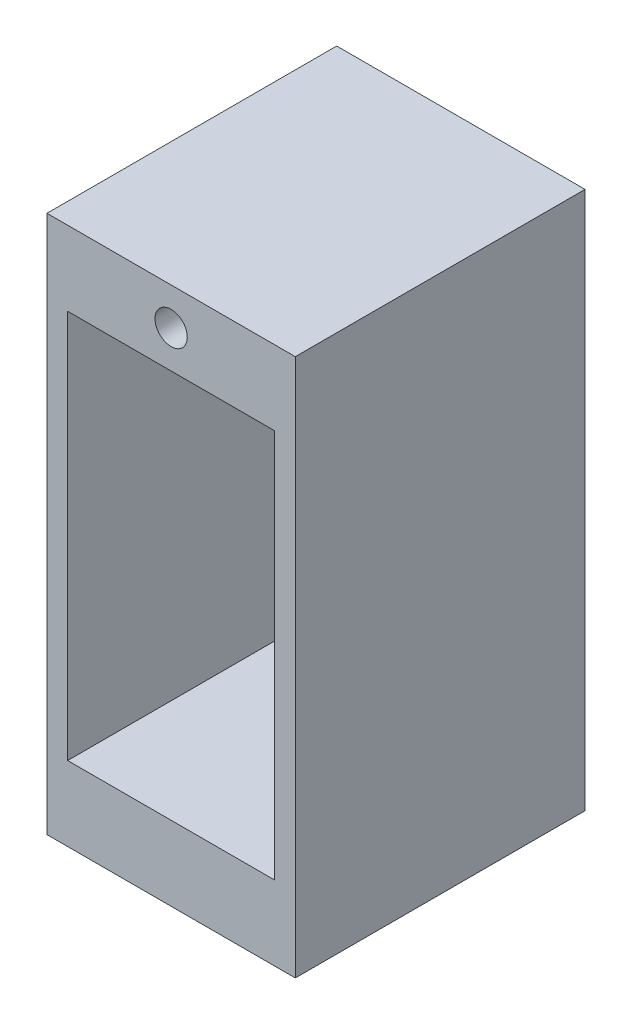
ISO-10303-21;
HEADER;
FILE_DESCRIPTION(('STEP AP214'),'2;1');
FILE_NAME('part.step','',(''),(''),'','','');
FILE_SCHEMA(('AUTOMOTIVE_DESIGN { 1 0 10303 214 1 1 1 1 }'));
ENDSEC;
DATA;
#1=APPLICATION_CONTEXT('core data for automotive mechanical design processes');
#2=APPLICATION_PROTOCOL_DEFINITION('international standard','automotive_design',2000,#1);
#3=PRODUCT_CONTEXT('',#1,'mechanical');
#4=PRODUCT('Part','Part','',(#3));
#5=PRODUCT_RELATED_PRODUCT_CATEGORY('part','',(#4));
#6=PRODUCT_DEFINITION_FORMATION('','',#4);
#7=PRODUCT_DEFINITION_CONTEXT('part definition',#1,'design');
#8=PRODUCT_DEFINITION('design','',#6,#7);
#9=PRODUCT_DEFINITION_SHAPE('','',#8);
#10=(LENGTH_UNIT() NAMED_UNIT(*) SI_UNIT(.MILLI.,.METRE.));
#11=(NAMED_UNIT(*) PLANE_ANGLE_UNIT() SI_UNIT($,.RADIAN.));
#12=(NAMED_UNIT(*) SI_UNIT($,.STERADIAN.) SOLID_ANGLE_UNIT());
#13=UNCERTAINTY_MEASURE_WITH_UNIT(LENGTH_MEASURE(1.E-05),#10,'distance_accuracy_value','');
#14=(GEOMETRIC_REPRESENTATION_CONTEXT(3) GLOBAL_UNCERTAINTY_ASSIGNED_CONTEXT((#13)) GLOBAL_UNIT_ASSIGNED_CONTEXT((#10,
#11,#12)) REPRESENTATION_CONTEXT('',''));
#15=CARTESIAN_POINT('',(0.,0.,0.));
#16=DIRECTION('',(0.,0.,1.));
#17=DIRECTION('',(1.,0.,0.));
#18=AXIS2_PLACEMENT_3D('',#15,#16,#17);
#19=CARTESIAN_POINT('',(-23.6123595505618,14.2584269662921,17.5));
#20=DIRECTION('',(1.,0.,0.));
#21=DIRECTION('',(0.,1.,0.));
#22=AXIS2_PLACEMENT_3D('',#19,#20,#21);
#23=PLANE('',#22);
#24=DIRECTION('',(0.,-1.,0.));
#25=VECTOR('',#24,1.);
#26=CARTESIAN_POINT('',(-23.6123595505618,14.2584269662921,0.));
#27=LINE('',#26,#25);
#28=CARTESIAN_POINT('',(-23.6123595505618,14.2584269662921,0.));
#29=VERTEX_POINT('',#28);
#30=CARTESIAN_POINT('',(-23.6123595505618,-18.2415730337079,0.));
#31=VERTEX_POINT('',#30);
#32=EDGE_CURVE('E157',#29,#31,#27,.T.);
#33=ORIENTED_EDGE('',*,*,#32,.T.);
#34=DIRECTION('',(0.,0.,-1.));
#35=VECTOR('',#34,1.);
#36=CARTESIAN_POINT('',(-23.6123595505618,-18.2415730337079,17.5));
#37=LINE('',#36,#35);
#38=CARTESIAN_POINT('',(-23.6123595505618,-18.2415730337079,17.5));
#39=VERTEX_POINT('',#38);
#40=EDGE_CURVE('E11',#39,#31,#37,.T.);
#41=ORIENTED_EDGE('',*,*,#40,.F.);
#42=DIRECTION('',(0.,-1.,0.));
#43=VECTOR('',#42,1.);
#44=CARTESIAN_POINT('',(-23.6123595505618,14.2584269662921,17.5));
#45=LINE('',#44,#43);
#46=CARTESIAN_POINT('',(-23.6123595505618,14.2584269662921,17.5));
#47=VERTEX_POINT('',#46);
#48=EDGE_CURVE('E163',#47,#39,#45,.T.);
#49=ORIENTED_EDGE('',*,*,#48,.F.);
#50=DIRECTION('',(0.,0.,-1.));
#51=VECTOR('',#50,1.);
#52=CARTESIAN_POINT('',(-23.6123595505618,14.2584269662921,17.5));
#53=LINE('',#52,#51);
#54=EDGE_CURVE('E177',#47,#29,#53,.T.);
#55=ORIENTED_EDGE('',*,*,#54,.T.);
#56=EDGE_LOOP('',(#33,#41,#49,#55));
#57=FACE_BOUND('',#56,.T.);
#58=ADVANCED_FACE('F45',(#57),#23,.F.);
#59=CARTESIAN_POINT('',(-23.6123595505618,-18.2415730337079,17.5));
#60=DIRECTION('',(0.,1.,0.));
#61=DIRECTION('',(0.,0.,1.));
#62=AXIS2_PLACEMENT_3D('',#59,#60,#61);
#63=PLANE('',#62);
#64=DIRECTION('',(1.,0.,0.));
#65=VECTOR('',#64,1.);
#66=CARTESIAN_POINT('',(-23.6123595505618,-18.2415730337079,0.));
#67=LINE('',#66,#65);
#68=CARTESIAN_POINT('',(-8.61235955056179,-18.2415730337079,0.));
#69=VERTEX_POINT('',#68);
#70=EDGE_CURVE('E181',#31,#69,#67,.T.);
#71=ORIENTED_EDGE('',*,*,#70,.T.);
#72=DIRECTION('',(0.,0.,-1.));
#73=VECTOR('',#72,1.);
#74=CARTESIAN_POINT('',(-8.61235955056179,-18.2415730337079,17.5));
#75=LINE('',#74,#73);
#76=CARTESIAN_POINT('',(-8.61235955056179,-18.2415730337079,17.5));
#77=VERTEX_POINT('',#76);
#78=EDGE_CURVE('E53',#77,#69,#75,.T.);
#79=ORIENTED_EDGE('',*,*,#78,.F.);
#80=DIRECTION('',(1.,0.,0.));
#81=VECTOR('',#80,1.);
#82=CARTESIAN_POINT('',(-23.6123595505618,-18.2415730337079,17.5));
#83=LINE('',#82,#81);
#84=EDGE_CURVE('E167',#39,#77,#83,.T.);
#85=ORIENTED_EDGE('',*,*,#84,.F.);
#86=ORIENTED_EDGE('',*,*,#40,.T.);
#87=EDGE_LOOP('',(#71,#79,#85,#86));
#88=FACE_BOUND('',#87,.T.);
#89=ADVANCED_FACE('F215',(#88),#63,.F.);
#90=CARTESIAN_POINT('',(-8.61235955056179,14.2584269662921,17.5));
#91=DIRECTION('',(-1.,0.,0.));
#92=DIRECTION('',(0.,-1.,0.));
#93=AXIS2_PLACEMENT_3D('',#90,#91,#92);
#94=PLANE('',#93);
#95=DIRECTION('',(0.,1.,0.));
#96=VECTOR('',#95,1.);
#97=CARTESIAN_POINT('',(-8.61235955056179,14.2584269662921,0.));
#98=LINE('',#97,#96);
#99=CARTESIAN_POINT('',(-8.61235955056179,14.2584269662921,0.));
#100=VERTEX_POINT('',#99);
#101=EDGE_CURVE('E184',#69,#100,#98,.T.);
#102=ORIENTED_EDGE('',*,*,#101,.T.);
#103=DIRECTION('',(0.,0.,-1.));
#104=VECTOR('',#103,1.);
#105=CARTESIAN_POINT('',(-8.61235955056179,14.2584269662921,17.5));
#106=LINE('',#105,#104);
#107=CARTESIAN_POINT('',(-8.61235955056179,14.2584269662921,17.5));
#108=VERTEX_POINT('',#107);
#109=EDGE_CURVE('E192',#108,#100,#106,.T.);
#110=ORIENTED_EDGE('',*,*,#109,.F.);
#111=DIRECTION('',(0.,1.,0.));
#112=VECTOR('',#111,1.);
#113=CARTESIAN_POINT('',(-8.61235955056179,14.2584269662921,17.5));
#114=LINE('',#113,#112);
#115=EDGE_CURVE('E171',#77,#108,#114,.T.);
#116=ORIENTED_EDGE('',*,*,#115,.F.);
#117=ORIENTED_EDGE('',*,*,#78,.T.);
#118=EDGE_LOOP('',(#102,#110,#116,#117));
#119=FACE_BOUND('',#118,.T.);
#120=ADVANCED_FACE('F201',(#119),#94,.F.);
#121=CARTESIAN_POINT('',(-23.6123595505618,14.2584269662921,17.5));
#122=DIRECTION('',(0.,-1.,0.));
#123=DIRECTION('',(0.,0.,-1.));
#124=AXIS2_PLACEMENT_3D('',#121,#122,#123);
#125=PLANE('',#124);
#126=DIRECTION('',(-1.,0.,0.));
#127=VECTOR('',#126,1.);
#128=CARTESIAN_POINT('',(-23.6123595505618,14.2584269662921,0.));
#129=LINE('',#128,#127);
#130=EDGE_CURVE('E168',#100,#29,#129,.T.);
#131=ORIENTED_EDGE('',*,*,#130,.T.);
#132=ORIENTED_EDGE('',*,*,#54,.F.);
#133=DIRECTION('',(-1.,0.,0.));
#134=VECTOR('',#133,1.);
#135=CARTESIAN_POINT('',(-23.6123595505618,14.2584269662921,17.5));
#136=LINE('',#135,#134);
#137=EDGE_CURVE('E174',#108,#47,#136,.T.);
#138=ORIENTED_EDGE('',*,*,#137,.F.);
#139=ORIENTED_EDGE('',*,*,#109,.T.);
#140=EDGE_LOOP('',(#131,#132,#138,#139));
#141=FACE_BOUND('',#140,.T.);
#142=ADVANCED_FACE('F210',(#141),#125,.F.);
#143=CARTESIAN_POINT('',(0.,0.,17.5));
#144=DIRECTION('',(0.,0.,1.));
#145=DIRECTION('',(1.,0.,0.));
#146=AXIS2_PLACEMENT_3D('',#143,#144,#145);
#147=PLANE('',#146);
#148=CARTESIAN_POINT('',(-16.1123595505618,12.0084269662921,17.5));
#149=DIRECTION('',(0.,0.,1.));
#150=DIRECTION('',(1.,0.,0.));
#151=AXIS2_PLACEMENT_3D('',#148,#149,#150);
#152=CIRCLE('',#151,0.975);
#153=CARTESIAN_POINT('',(-15.1373595505618,12.0084269662921,17.5));
#154=VERTEX_POINT('',#153);
#155=EDGE_CURVE('E138',#154,#154,#152,.T.);
#156=ORIENTED_EDGE('',*,*,#155,.F.);
#157=EDGE_LOOP('',(#156));
#158=FACE_BOUND('',#157,.T.);
#159=DIRECTION('',(0.,-1.,0.));
#160=VECTOR('',#159,1.);
#161=CARTESIAN_POINT('',(-9.86235955056179,-13.7415730337079,17.5));
#162=LINE('',#161,#160);
#163=CARTESIAN_POINT('',(-9.86235955056179,9.75842696629214,17.5));
#164=VERTEX_POINT('',#163);
#165=CARTESIAN_POINT('',(-9.86235955056179,-13.7415730337079,17.5));
#166=VERTEX_POINT('',#165);
#167=EDGE_CURVE('E112',#164,#166,#162,.T.);
#168=ORIENTED_EDGE('',*,*,#167,.T.);
#169=DIRECTION('',(-1.,0.,0.));
#170=VECTOR('',#169,1.);
#171=CARTESIAN_POINT('',(-22.3623595505618,-13.7415730337079,17.5));
#172=LINE('',#171,#170);
#173=CARTESIAN_POINT('',(-22.3623595505618,-13.7415730337079,17.5));
#174=VERTEX_POINT('',#173);
#175=EDGE_CURVE('E122',#166,#174,#172,.T.);
#176=ORIENTED_EDGE('',*,*,#175,.T.);
#177=DIRECTION('',(0.,1.,0.));
#178=VECTOR('',#177,1.);
#179=CARTESIAN_POINT('',(-22.3623595505618,-13.7415730337079,17.5));
#180=LINE('',#179,#178);
#181=CARTESIAN_POINT('',(-22.3623595505618,9.75842696629214,17.5));
#182=VERTEX_POINT('',#181);
#183=EDGE_CURVE('E60',#174,#182,#180,.T.);
#184=ORIENTED_EDGE('',*,*,#183,.T.);
#185=DIRECTION('',(1.,0.,0.));
#186=VECTOR('',#185,1.);
#187=CARTESIAN_POINT('',(-22.3623595505618,9.75842696629214,17.5));
#188=LINE('',#187,#186);
#189=EDGE_CURVE('E119',#182,#164,#188,.T.);
#190=ORIENTED_EDGE('',*,*,#189,.T.);
#191=EDGE_LOOP('',(#168,#176,#184,#190));
#192=FACE_BOUND('',#191,.T.);
#193=ORIENTED_EDGE('',*,*,#48,.T.);
#194=ORIENTED_EDGE('',*,*,#84,.T.);
#195=ORIENTED_EDGE('',*,*,#115,.T.);
#196=ORIENTED_EDGE('',*,*,#137,.T.);
#197=EDGE_LOOP('',(#193,#194,#195,#196));
#198=FACE_BOUND('',#197,.T.);
#199=ADVANCED_FACE('F127',(#158,#192,#198),#147,.T.);
#200=CARTESIAN_POINT('',(0.,0.,0.));
#201=DIRECTION('',(0.,0.,1.));
#202=DIRECTION('',(1.,0.,0.));
#203=AXIS2_PLACEMENT_3D('',#200,#201,#202);
#204=PLANE('',#203);
#205=DIRECTION('',(-1.,0.,0.));
#206=VECTOR('',#205,1.);
#207=CARTESIAN_POINT('',(-22.3623595505618,-13.7415730337079,0.));
#208=LINE('',#207,#206);
#209=CARTESIAN_POINT('',(-9.86235955056179,-13.7415730337079,0.));
#210=VERTEX_POINT('',#209);
#211=CARTESIAN_POINT('',(-22.3623595505618,-13.7415730337079,0.));
#212=VERTEX_POINT('',#211);
#213=EDGE_CURVE('E147',#210,#212,#208,.T.);
#214=ORIENTED_EDGE('',*,*,#213,.F.);
#215=DIRECTION('',(0.,-1.,0.));
#216=VECTOR('',#215,1.);
#217=CARTESIAN_POINT('',(-9.86235955056179,-13.7415730337079,0.));
#218=LINE('',#217,#216);
#219=CARTESIAN_POINT('',(-9.86235955056179,9.75842696629214,0.));
#220=VERTEX_POINT('',#219);
#221=EDGE_CURVE('E68',#220,#210,#218,.T.);
#222=ORIENTED_EDGE('',*,*,#221,.F.);
#223=DIRECTION('',(1.,0.,0.));
#224=VECTOR('',#223,1.);
#225=CARTESIAN_POINT('',(-22.3623595505618,9.75842696629214,0.));
#226=LINE('',#225,#224);
#227=CARTESIAN_POINT('',(-22.3623595505618,9.75842696629214,0.));
#228=VERTEX_POINT('',#227);
#229=EDGE_CURVE('E131',#228,#220,#226,.T.);
#230=ORIENTED_EDGE('',*,*,#229,.F.);
#231=DIRECTION('',(0.,1.,0.));
#232=VECTOR('',#231,1.);
#233=CARTESIAN_POINT('',(-22.3623595505618,-13.7415730337079,0.));
#234=LINE('',#233,#232);
#235=EDGE_CURVE('E135',#212,#228,#234,.T.);
#236=ORIENTED_EDGE('',*,*,#235,.F.);
#237=EDGE_LOOP('',(#214,#222,#230,#236));
#238=FACE_BOUND('',#237,.T.);
#239=ORIENTED_EDGE('',*,*,#32,.F.);
#240=ORIENTED_EDGE('',*,*,#130,.F.);
#241=ORIENTED_EDGE('',*,*,#101,.F.);
#242=ORIENTED_EDGE('',*,*,#70,.F.);
#243=EDGE_LOOP('',(#239,#240,#241,#242));
#244=FACE_BOUND('',#243,.T.);
#245=ADVANCED_FACE('F207',(#238,#244),#204,.F.);
#246=CARTESIAN_POINT('',(-9.86235955056179,-13.7415730337079,17.5));
#247=DIRECTION('',(1.,0.,0.));
#248=DIRECTION('',(0.,1.,0.));
#249=AXIS2_PLACEMENT_3D('',#246,#247,#248);
#250=PLANE('',#249);
#251=ORIENTED_EDGE('',*,*,#221,.T.);
#252=DIRECTION('',(0.,0.,-1.));
#253=VECTOR('',#252,1.);
#254=CARTESIAN_POINT('',(-9.86235955056179,-13.7415730337079,17.5));
#255=LINE('',#254,#253);
#256=EDGE_CURVE('E108',#166,#210,#255,.T.);
#257=ORIENTED_EDGE('',*,*,#256,.F.);
#258=ORIENTED_EDGE('',*,*,#167,.F.);
#259=DIRECTION('',(0.,0.,-1.));
#260=VECTOR('',#259,1.);
#261=CARTESIAN_POINT('',(-9.86235955056179,9.75842696629214,17.5));
#262=LINE('',#261,#260);
#263=EDGE_CURVE('E154',#164,#220,#262,.T.);
#264=ORIENTED_EDGE('',*,*,#263,.T.);
#265=EDGE_LOOP('',(#251,#257,#258,#264));
#266=FACE_BOUND('',#265,.T.);
#267=ADVANCED_FACE('F110',(#266),#250,.F.);
#268=CARTESIAN_POINT('',(-22.3623595505618,9.75842696629214,17.5));
#269=DIRECTION('',(0.,1.,0.));
#270=DIRECTION('',(-1.,0.,0.));
#271=AXIS2_PLACEMENT_3D('',#268,#269,#270);
#272=PLANE('',#271);
#273=ORIENTED_EDGE('',*,*,#229,.T.);
#274=ORIENTED_EDGE('',*,*,#263,.F.);
#275=ORIENTED_EDGE('',*,*,#189,.F.);
#276=DIRECTION('',(0.,0.,-1.));
#277=VECTOR('',#276,1.);
#278=CARTESIAN_POINT('',(-22.3623595505618,9.75842696629214,17.5));
#279=LINE('',#278,#277);
#280=EDGE_CURVE('E158',#182,#228,#279,.T.);
#281=ORIENTED_EDGE('',*,*,#280,.T.);
#282=EDGE_LOOP('',(#273,#274,#275,#281));
#283=FACE_BOUND('',#282,.T.);
#284=ADVANCED_FACE('F233',(#283),#272,.F.);
#285=CARTESIAN_POINT('',(-22.3623595505618,-13.7415730337079,17.5));
#286=DIRECTION('',(-1.,0.,0.));
#287=DIRECTION('',(0.,0.,1.));
#288=AXIS2_PLACEMENT_3D('',#285,#286,#287);
#289=PLANE('',#288);
#290=ORIENTED_EDGE('',*,*,#235,.T.);
#291=ORIENTED_EDGE('',*,*,#280,.F.);
#292=ORIENTED_EDGE('',*,*,#183,.F.);
#293=DIRECTION('',(0.,0.,-1.));
#294=VECTOR('',#293,1.);
#295=CARTESIAN_POINT('',(-22.3623595505618,-13.7415730337079,17.5));
#296=LINE('',#295,#294);
#297=EDGE_CURVE('E118',#174,#212,#296,.T.);
#298=ORIENTED_EDGE('',*,*,#297,.T.);
#299=EDGE_LOOP('',(#290,#291,#292,#298));
#300=FACE_BOUND('',#299,.T.);
#301=ADVANCED_FACE('F237',(#300),#289,.F.);
#302=CARTESIAN_POINT('',(-22.3623595505618,-13.7415730337079,17.5));
#303=DIRECTION('',(0.,-1.,0.));
#304=DIRECTION('',(1.,0.,0.));
#305=AXIS2_PLACEMENT_3D('',#302,#303,#304);
#306=PLANE('',#305);
#307=ORIENTED_EDGE('',*,*,#213,.T.);
#308=ORIENTED_EDGE('',*,*,#297,.F.);
#309=ORIENTED_EDGE('',*,*,#175,.F.);
#310=ORIENTED_EDGE('',*,*,#256,.T.);
#311=EDGE_LOOP('',(#307,#308,#309,#310));
#312=FACE_BOUND('',#311,.T.);
#313=ADVANCED_FACE('F123',(#312),#306,.F.);
#314=CARTESIAN_POINT('',(-16.1123595505618,12.0084269662921,9.5));
#315=DIRECTION('',(0.,0.,1.));
#316=DIRECTION('',(1.,0.,0.));
#317=AXIS2_PLACEMENT_3D('',#314,#315,#316);
#318=CYLINDRICAL_SURFACE('',#317,0.975);
#319=CARTESIAN_POINT('',(-16.1123595505618,12.0084269662921,9.5));
#320=DIRECTION('',(0.,0.,1.));
#321=DIRECTION('',(1.,0.,0.));
#322=AXIS2_PLACEMENT_3D('',#319,#320,#321);
#323=CIRCLE('',#322,0.975);
#324=CARTESIAN_POINT('',(-15.1373595505618,12.0084269662921,9.5));
#325=VERTEX_POINT('',#324);
#326=EDGE_CURVE('E148',#325,#325,#323,.T.);
#327=ORIENTED_EDGE('',*,*,#326,.F.);
#328=EDGE_LOOP('',(#327));
#329=FACE_BOUND('',#328,.T.);
#330=ORIENTED_EDGE('',*,*,#155,.T.);
#331=EDGE_LOOP('',(#330));
#332=FACE_BOUND('',#331,.T.);
#333=ADVANCED_FACE('F236',(#329,#332),#318,.F.);
#334=CARTESIAN_POINT('',(-16.1123595505618,12.0084269662921,9.5));
#335=DIRECTION('',(0.,0.,1.));
#336=DIRECTION('',(1.,0.,0.));
#337=AXIS2_PLACEMENT_3D('',#334,#335,#336);
#338=PLANE('',#337);
#339=ORIENTED_EDGE('',*,*,#326,.T.);
#340=EDGE_LOOP('',(#339));
#341=FACE_BOUND('',#340,.T.);
#342=ADVANCED_FACE('F245',(#341),#338,.T.);
#343=CLOSED_SHELL('',(#58,#89,#120,#142,#199,#245,#267,#284,#301,#313,#333,#342));
#344=MANIFOLD_SOLID_BREP('B2',#343);
#345=ADVANCED_BREP_SHAPE_REPRESENTATION('',(#18,#344),#14);
#346=SHAPE_DEFINITION_REPRESENTATION(#9,#345);
ENDSEC;
END-ISO-10303-21;
